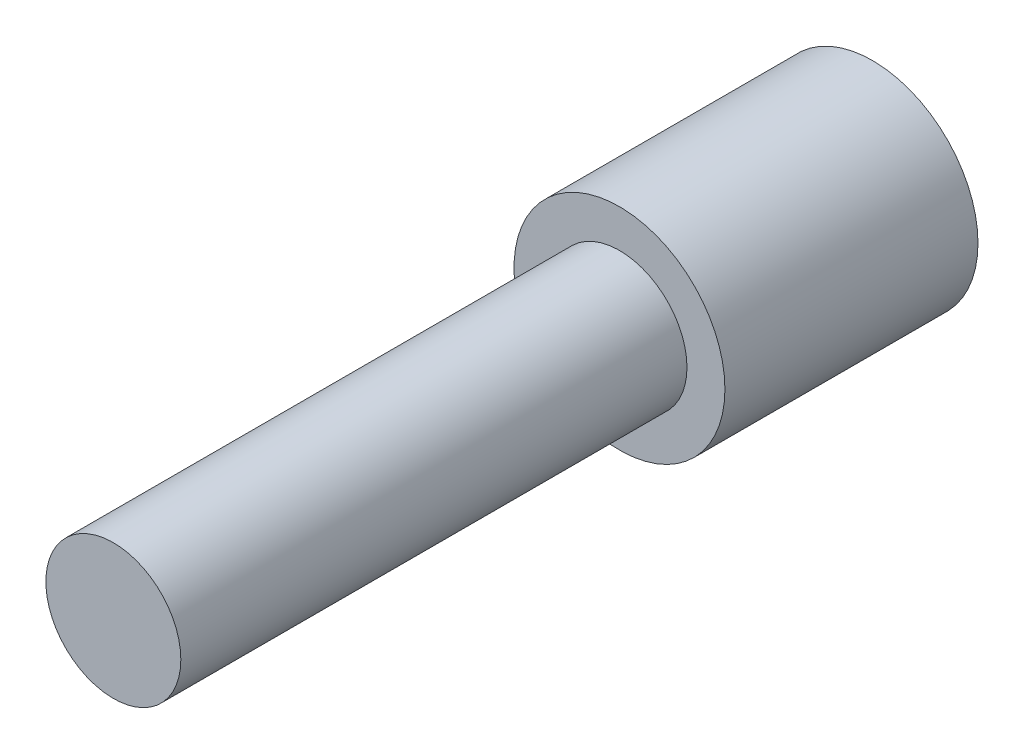
ISO-10303-21;
HEADER;
FILE_DESCRIPTION(('STEP AP214'),'2;1');
FILE_NAME('part.step','',(''),(''),'','','');
FILE_SCHEMA(('AUTOMOTIVE_DESIGN { 1 0 10303 214 1 1 1 1 }'));
ENDSEC;
DATA;
#1=APPLICATION_CONTEXT('core data for automotive mechanical design processes');
#2=APPLICATION_PROTOCOL_DEFINITION('international standard','automotive_design',2000,#1);
#3=PRODUCT_CONTEXT('',#1,'mechanical');
#4=PRODUCT('Part','Part','',(#3));
#5=PRODUCT_RELATED_PRODUCT_CATEGORY('part','',(#4));
#6=PRODUCT_DEFINITION_FORMATION('','',#4);
#7=PRODUCT_DEFINITION_CONTEXT('part definition',#1,'design');
#8=PRODUCT_DEFINITION('design','',#6,#7);
#9=PRODUCT_DEFINITION_SHAPE('','',#8);
#10=(LENGTH_UNIT() NAMED_UNIT(*) SI_UNIT(.MILLI.,.METRE.));
#11=(NAMED_UNIT(*) PLANE_ANGLE_UNIT() SI_UNIT($,.RADIAN.));
#12=(NAMED_UNIT(*) SI_UNIT($,.STERADIAN.) SOLID_ANGLE_UNIT());
#13=UNCERTAINTY_MEASURE_WITH_UNIT(LENGTH_MEASURE(1.E-05),#10,'distance_accuracy_value','');
#14=(GEOMETRIC_REPRESENTATION_CONTEXT(3) GLOBAL_UNCERTAINTY_ASSIGNED_CONTEXT((#13)) GLOBAL_UNIT_ASSIGNED_CONTEXT((#10,
#11,#12)) REPRESENTATION_CONTEXT('',''));
#15=CARTESIAN_POINT('',(0.,0.,0.));
#16=DIRECTION('',(0.,0.,1.));
#17=DIRECTION('',(1.,0.,0.));
#18=AXIS2_PLACEMENT_3D('',#15,#16,#17);
#19=CARTESIAN_POINT('',(0.,0.,15.));
#20=DIRECTION('',(0.,0.,-1.));
#21=DIRECTION('',(-1.,0.,0.));
#22=AXIS2_PLACEMENT_3D('',#19,#20,#21);
#23=CYLINDRICAL_SURFACE('',#22,6.25);
#24=CARTESIAN_POINT('',(0.,0.,15.));
#25=DIRECTION('',(0.,0.,1.));
#26=DIRECTION('',(1.,0.,0.));
#27=AXIS2_PLACEMENT_3D('',#24,#25,#26);
#28=CIRCLE('',#27,6.25);
#29=CARTESIAN_POINT('',(6.25,0.,15.));
#30=VERTEX_POINT('',#29);
#31=EDGE_CURVE('E42',#30,#30,#28,.T.);
#32=ORIENTED_EDGE('',*,*,#31,.F.);
#33=EDGE_LOOP('',(#32));
#34=FACE_BOUND('',#33,.T.);
#35=CARTESIAN_POINT('',(0.,0.,0.));
#36=DIRECTION('',(0.,0.,1.));
#37=DIRECTION('',(1.,0.,0.));
#38=AXIS2_PLACEMENT_3D('',#35,#36,#37);
#39=CIRCLE('',#38,6.25);
#40=CARTESIAN_POINT('',(6.25,0.,0.));
#41=VERTEX_POINT('',#40);
#42=EDGE_CURVE('E38',#41,#41,#39,.T.);
#43=ORIENTED_EDGE('',*,*,#42,.T.);
#44=EDGE_LOOP('',(#43));
#45=FACE_BOUND('',#44,.T.);
#46=ADVANCED_FACE('F35',(#34,#45),#23,.T.);
#47=CARTESIAN_POINT('',(0.,0.,15.));
#48=DIRECTION('',(0.,0.,1.));
#49=DIRECTION('',(1.,0.,0.));
#50=AXIS2_PLACEMENT_3D('',#47,#48,#49);
#51=PLANE('',#50);
#52=CARTESIAN_POINT('',(0.,0.,15.));
#53=DIRECTION('',(0.,0.,1.));
#54=DIRECTION('',(1.,0.,0.));
#55=AXIS2_PLACEMENT_3D('',#52,#53,#54);
#56=CIRCLE('',#55,4.);
#57=CARTESIAN_POINT('',(4.,0.,15.));
#58=VERTEX_POINT('',#57);
#59=EDGE_CURVE('E10',#58,#58,#56,.T.);
#60=ORIENTED_EDGE('',*,*,#59,.F.);
#61=EDGE_LOOP('',(#60));
#62=FACE_BOUND('',#61,.T.);
#63=ORIENTED_EDGE('',*,*,#31,.T.);
#64=EDGE_LOOP('',(#63));
#65=FACE_BOUND('',#64,.T.);
#66=ADVANCED_FACE('F71',(#62,#65),#51,.T.);
#67=CARTESIAN_POINT('',(0.,0.,0.));
#68=DIRECTION('',(0.,0.,1.));
#69=DIRECTION('',(1.,0.,0.));
#70=AXIS2_PLACEMENT_3D('',#67,#68,#69);
#71=PLANE('',#70);
#72=CARTESIAN_POINT('',(0.,0.,0.));
#73=DIRECTION('',(0.,0.,-1.));
#74=DIRECTION('',(-1.,0.,0.));
#75=AXIS2_PLACEMENT_3D('',#72,#73,#74);
#76=CIRCLE('',#75,2.);
#77=CARTESIAN_POINT('',(-2.,0.,0.));
#78=VERTEX_POINT('',#77);
#79=EDGE_CURVE('E52',#78,#78,#76,.T.);
#80=ORIENTED_EDGE('',*,*,#79,.F.);
#81=EDGE_LOOP('',(#80));
#82=FACE_BOUND('',#81,.T.);
#83=ORIENTED_EDGE('',*,*,#42,.F.);
#84=EDGE_LOOP('',(#83));
#85=FACE_BOUND('',#84,.T.);
#86=ADVANCED_FACE('F67',(#82,#85),#71,.F.);
#87=CARTESIAN_POINT('',(0.,0.,45.));
#88=DIRECTION('',(0.,0.,-1.));
#89=DIRECTION('',(-1.,0.,0.));
#90=AXIS2_PLACEMENT_3D('',#87,#88,#89);
#91=CYLINDRICAL_SURFACE('',#90,4.);
#92=CARTESIAN_POINT('',(0.,0.,45.));
#93=DIRECTION('',(0.,0.,1.));
#94=DIRECTION('',(1.,0.,0.));
#95=AXIS2_PLACEMENT_3D('',#92,#93,#94);
#96=CIRCLE('',#95,4.);
#97=CARTESIAN_POINT('',(4.,0.,45.));
#98=VERTEX_POINT('',#97);
#99=EDGE_CURVE('E48',#98,#98,#96,.T.);
#100=ORIENTED_EDGE('',*,*,#99,.F.);
#101=EDGE_LOOP('',(#100));
#102=FACE_BOUND('',#101,.T.);
#103=ORIENTED_EDGE('',*,*,#59,.T.);
#104=EDGE_LOOP('',(#103));
#105=FACE_BOUND('',#104,.T.);
#106=ADVANCED_FACE('F70',(#102,#105),#91,.T.);
#107=CARTESIAN_POINT('',(0.,0.,45.));
#108=DIRECTION('',(0.,0.,1.));
#109=DIRECTION('',(1.,0.,0.));
#110=AXIS2_PLACEMENT_3D('',#107,#108,#109);
#111=PLANE('',#110);
#112=ORIENTED_EDGE('',*,*,#99,.T.);
#113=EDGE_LOOP('',(#112));
#114=FACE_BOUND('',#113,.T.);
#115=ADVANCED_FACE('F63',(#114),#111,.T.);
#116=CARTESIAN_POINT('',(0.,0.,12.));
#117=DIRECTION('',(0.,0.,-1.));
#118=DIRECTION('',(-1.,0.,0.));
#119=AXIS2_PLACEMENT_3D('',#116,#117,#118);
#120=CYLINDRICAL_SURFACE('',#119,2.);
#121=CARTESIAN_POINT('',(0.,0.,12.));
#122=DIRECTION('',(0.,0.,-1.));
#123=DIRECTION('',(-1.,0.,0.));
#124=AXIS2_PLACEMENT_3D('',#121,#122,#123);
#125=CIRCLE('',#124,2.);
#126=CARTESIAN_POINT('',(-2.,0.,12.));
#127=VERTEX_POINT('',#126);
#128=EDGE_CURVE('E51',#127,#127,#125,.T.);
#129=ORIENTED_EDGE('',*,*,#128,.F.);
#130=EDGE_LOOP('',(#129));
#131=FACE_BOUND('',#130,.T.);
#132=ORIENTED_EDGE('',*,*,#79,.T.);
#133=EDGE_LOOP('',(#132));
#134=FACE_BOUND('',#133,.T.);
#135=ADVANCED_FACE('F60',(#131,#134),#120,.F.);
#136=CARTESIAN_POINT('',(0.,0.,12.));
#137=DIRECTION('',(0.,0.,-1.));
#138=DIRECTION('',(-1.,0.,0.));
#139=AXIS2_PLACEMENT_3D('',#136,#137,#138);
#140=PLANE('',#139);
#141=ORIENTED_EDGE('',*,*,#128,.T.);
#142=EDGE_LOOP('',(#141));
#143=FACE_BOUND('',#142,.T.);
#144=ADVANCED_FACE('F58',(#143),#140,.T.);
#145=CLOSED_SHELL('',(#46,#66,#86,#106,#115,#135,#144));
#146=MANIFOLD_SOLID_BREP('B2',#145);
#147=ADVANCED_BREP_SHAPE_REPRESENTATION('',(#18,#146),#14);
#148=SHAPE_DEFINITION_REPRESENTATION(#9,#147);
ENDSEC;
END-ISO-10303-21;
